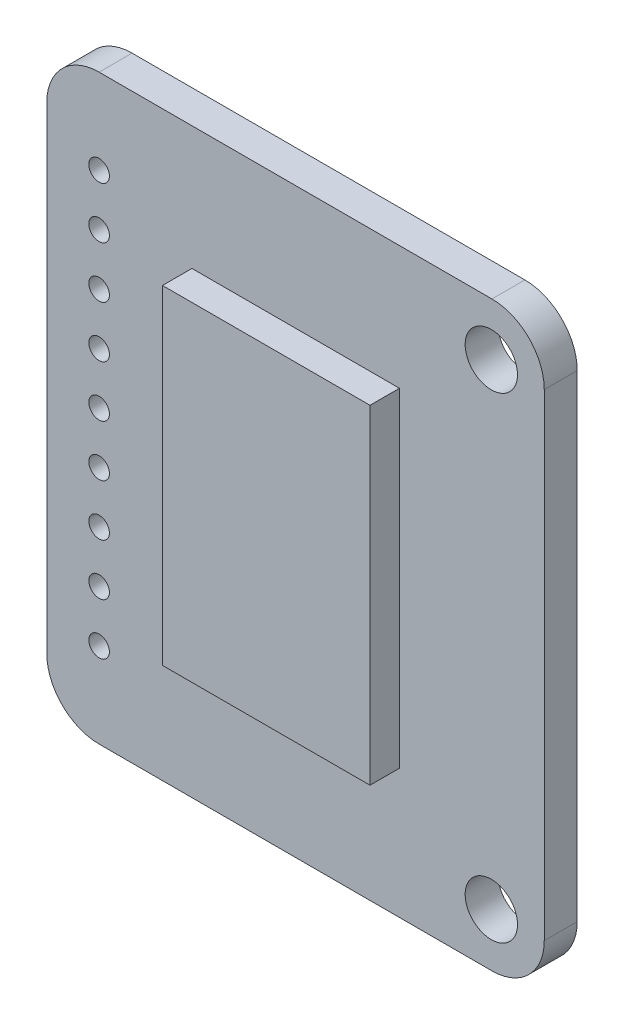
ISO-10303-21;
HEADER;
FILE_DESCRIPTION(('STEP AP214'),'2;1');
FILE_NAME('part.step','',(''),(''),'','','');
FILE_SCHEMA(('AUTOMOTIVE_DESIGN { 1 0 10303 214 1 1 1 1 }'));
ENDSEC;
DATA;
#1=APPLICATION_CONTEXT('core data for automotive mechanical design processes');
#2=APPLICATION_PROTOCOL_DEFINITION('international standard','automotive_design',2000,#1);
#3=PRODUCT_CONTEXT('',#1,'mechanical');
#4=PRODUCT('Part','Part','',(#3));
#5=PRODUCT_RELATED_PRODUCT_CATEGORY('part','',(#4));
#6=PRODUCT_DEFINITION_FORMATION('','',#4);
#7=PRODUCT_DEFINITION_CONTEXT('part definition',#1,'design');
#8=PRODUCT_DEFINITION('design','',#6,#7);
#9=PRODUCT_DEFINITION_SHAPE('','',#8);
#10=(LENGTH_UNIT() NAMED_UNIT(*) SI_UNIT(.MILLI.,.METRE.));
#11=(NAMED_UNIT(*) PLANE_ANGLE_UNIT() SI_UNIT($,.RADIAN.));
#12=(NAMED_UNIT(*) SI_UNIT($,.STERADIAN.) SOLID_ANGLE_UNIT());
#13=UNCERTAINTY_MEASURE_WITH_UNIT(LENGTH_MEASURE(1.E-05),#10,'distance_accuracy_value','');
#14=(GEOMETRIC_REPRESENTATION_CONTEXT(3) GLOBAL_UNCERTAINTY_ASSIGNED_CONTEXT((#13)) GLOBAL_UNIT_ASSIGNED_CONTEXT((#10,
#11,#12)) REPRESENTATION_CONTEXT('',''));
#15=CARTESIAN_POINT('',(0.,0.,0.));
#16=DIRECTION('',(0.,0.,1.));
#17=DIRECTION('',(1.,0.,0.));
#18=AXIS2_PLACEMENT_3D('',#15,#16,#17);
#19=CARTESIAN_POINT('',(0.,0.,1.6));
#20=DIRECTION('',(0.,0.,-1.));
#21=DIRECTION('',(-1.,0.,0.));
#22=AXIS2_PLACEMENT_3D('',#19,#20,#21);
#23=PLANE('',#22);
#24=DIRECTION('',(-1.,0.,0.));
#25=VECTOR('',#24,1.);
#26=CARTESIAN_POINT('',(-12.075,14.125,1.6));
#27=LINE('',#26,#25);
#28=CARTESIAN_POINT('',(9.535,14.125,1.6));
#29=VERTEX_POINT('',#28);
#30=CARTESIAN_POINT('',(-9.53499999999999,14.125,1.6));
#31=VERTEX_POINT('',#30);
#32=EDGE_CURVE('E220',#29,#31,#27,.T.);
#33=ORIENTED_EDGE('',*,*,#32,.T.);
#34=CARTESIAN_POINT('',(-9.53499999999999,11.585,1.6));
#35=DIRECTION('',(0.,0.,-1.));
#36=DIRECTION('',(-1.,0.,0.));
#37=AXIS2_PLACEMENT_3D('',#34,#35,#36);
#38=CIRCLE('',#37,2.54);
#39=CARTESIAN_POINT('',(-12.075,11.585,1.6));
#40=VERTEX_POINT('',#39);
#41=EDGE_CURVE('E264',#31,#40,#38,.F.);
#42=ORIENTED_EDGE('',*,*,#41,.T.);
#43=DIRECTION('',(0.,-1.,0.));
#44=VECTOR('',#43,1.);
#45=CARTESIAN_POINT('',(-12.075,-14.125,1.6));
#46=LINE('',#45,#44);
#47=CARTESIAN_POINT('',(-12.075,-11.585,1.6));
#48=VERTEX_POINT('',#47);
#49=EDGE_CURVE('E224',#40,#48,#46,.T.);
#50=ORIENTED_EDGE('',*,*,#49,.T.);
#51=CARTESIAN_POINT('',(-9.53499999999999,-11.585,1.6));
#52=DIRECTION('',(0.,0.,-1.));
#53=DIRECTION('',(-1.,0.,0.));
#54=AXIS2_PLACEMENT_3D('',#51,#52,#53);
#55=CIRCLE('',#54,2.54);
#56=CARTESIAN_POINT('',(-9.53499999999999,-14.125,1.6));
#57=VERTEX_POINT('',#56);
#58=EDGE_CURVE('E262',#48,#57,#55,.F.);
#59=ORIENTED_EDGE('',*,*,#58,.T.);
#60=DIRECTION('',(1.,0.,0.));
#61=VECTOR('',#60,1.);
#62=CARTESIAN_POINT('',(-12.075,-14.125,1.6));
#63=LINE('',#62,#61);
#64=CARTESIAN_POINT('',(9.535,-14.125,1.6));
#65=VERTEX_POINT('',#64);
#66=EDGE_CURVE('E227',#57,#65,#63,.T.);
#67=ORIENTED_EDGE('',*,*,#66,.T.);
#68=CARTESIAN_POINT('',(9.53500000000001,-11.585,1.6));
#69=DIRECTION('',(0.,0.,-1.));
#70=DIRECTION('',(-1.,0.,0.));
#71=AXIS2_PLACEMENT_3D('',#68,#69,#70);
#72=CIRCLE('',#71,2.54);
#73=CARTESIAN_POINT('',(12.075,-11.585,1.6));
#74=VERTEX_POINT('',#73);
#75=EDGE_CURVE('E260',#65,#74,#72,.F.);
#76=ORIENTED_EDGE('',*,*,#75,.T.);
#77=DIRECTION('',(0.,1.,0.));
#78=VECTOR('',#77,1.);
#79=CARTESIAN_POINT('',(12.075,-14.125,1.6));
#80=LINE('',#79,#78);
#81=CARTESIAN_POINT('',(12.075,11.585,1.6));
#82=VERTEX_POINT('',#81);
#83=EDGE_CURVE('E217',#74,#82,#80,.T.);
#84=ORIENTED_EDGE('',*,*,#83,.T.);
#85=CARTESIAN_POINT('',(9.53500000000001,11.585,1.6));
#86=DIRECTION('',(0.,0.,-1.));
#87=DIRECTION('',(-1.,0.,0.));
#88=AXIS2_PLACEMENT_3D('',#85,#86,#87);
#89=CIRCLE('',#88,2.54);
#90=EDGE_CURVE('E258',#82,#29,#89,.F.);
#91=ORIENTED_EDGE('',*,*,#90,.T.);
#92=EDGE_LOOP('',(#33,#42,#50,#59,#67,#76,#84,#91));
#93=FACE_BOUND('',#92,.T.);
#94=CARTESIAN_POINT('',(9.50500000000001,11.557,1.6));
#95=DIRECTION('',(0.,0.,1.));
#96=DIRECTION('',(1.,0.,0.));
#97=AXIS2_PLACEMENT_3D('',#94,#95,#96);
#98=CIRCLE('',#97,1.27);
#99=CARTESIAN_POINT('',(10.775,11.557,1.6));
#100=VERTEX_POINT('',#99);
#101=EDGE_CURVE('E208',#100,#100,#98,.T.);
#102=ORIENTED_EDGE('',*,*,#101,.F.);
#103=EDGE_LOOP('',(#102));
#104=FACE_BOUND('',#103,.T.);
#105=CARTESIAN_POINT('',(9.50500000000001,-11.557,1.6));
#106=DIRECTION('',(0.,0.,1.));
#107=DIRECTION('',(1.,0.,0.));
#108=AXIS2_PLACEMENT_3D('',#105,#106,#107);
#109=CIRCLE('',#108,1.27);
#110=CARTESIAN_POINT('',(10.775,-11.557,1.6));
#111=VERTEX_POINT('',#110);
#112=EDGE_CURVE('E202',#111,#111,#109,.T.);
#113=ORIENTED_EDGE('',*,*,#112,.F.);
#114=EDGE_LOOP('',(#113));
#115=FACE_BOUND('',#114,.T.);
#116=CARTESIAN_POINT('',(-9.53499999999999,0.,1.6));
#117=DIRECTION('',(0.,0.,1.));
#118=DIRECTION('',(1.,0.,0.));
#119=AXIS2_PLACEMENT_3D('',#116,#117,#118);
#120=CIRCLE('',#119,0.500000000000001);
#121=CARTESIAN_POINT('',(-9.03499999999999,0.,1.6));
#122=VERTEX_POINT('',#121);
#123=EDGE_CURVE('E198',#122,#122,#120,.T.);
#124=ORIENTED_EDGE('',*,*,#123,.F.);
#125=EDGE_LOOP('',(#124));
#126=FACE_BOUND('',#125,.T.);
#127=CARTESIAN_POINT('',(-9.53499999999999,-2.5,1.6));
#128=DIRECTION('',(0.,0.,1.));
#129=DIRECTION('',(1.,0.,0.));
#130=AXIS2_PLACEMENT_3D('',#127,#128,#129);
#131=CIRCLE('',#130,0.500000000000001);
#132=CARTESIAN_POINT('',(-9.03499999999999,-2.5,1.6));
#133=VERTEX_POINT('',#132);
#134=EDGE_CURVE('E195',#133,#133,#131,.T.);
#135=ORIENTED_EDGE('',*,*,#134,.F.);
#136=EDGE_LOOP('',(#135));
#137=FACE_BOUND('',#136,.T.);
#138=CARTESIAN_POINT('',(-9.53499999999999,10.,1.6));
#139=DIRECTION('',(0.,0.,1.));
#140=DIRECTION('',(1.,0.,0.));
#141=AXIS2_PLACEMENT_3D('',#138,#139,#140);
#142=CIRCLE('',#141,0.500000000000001);
#143=CARTESIAN_POINT('',(-9.03499999999999,10.,1.6));
#144=VERTEX_POINT('',#143);
#145=EDGE_CURVE('E148',#144,#144,#142,.T.);
#146=ORIENTED_EDGE('',*,*,#145,.F.);
#147=EDGE_LOOP('',(#146));
#148=FACE_BOUND('',#147,.T.);
#149=CARTESIAN_POINT('',(-9.53499999999999,7.5,1.6));
#150=DIRECTION('',(0.,0.,1.));
#151=DIRECTION('',(1.,0.,0.));
#152=AXIS2_PLACEMENT_3D('',#149,#150,#151);
#153=CIRCLE('',#152,0.500000000000001);
#154=CARTESIAN_POINT('',(-9.03499999999999,7.5,1.6));
#155=VERTEX_POINT('',#154);
#156=EDGE_CURVE('E183',#155,#155,#153,.T.);
#157=ORIENTED_EDGE('',*,*,#156,.F.);
#158=EDGE_LOOP('',(#157));
#159=FACE_BOUND('',#158,.T.);
#160=CARTESIAN_POINT('',(-9.53499999999999,5.,1.6));
#161=DIRECTION('',(0.,0.,1.));
#162=DIRECTION('',(1.,0.,0.));
#163=AXIS2_PLACEMENT_3D('',#160,#161,#162);
#164=CIRCLE('',#163,0.500000000000001);
#165=CARTESIAN_POINT('',(-9.03499999999999,5.,1.6));
#166=VERTEX_POINT('',#165);
#167=EDGE_CURVE('E177',#166,#166,#164,.T.);
#168=ORIENTED_EDGE('',*,*,#167,.F.);
#169=EDGE_LOOP('',(#168));
#170=FACE_BOUND('',#169,.T.);
#171=CARTESIAN_POINT('',(-9.53499999999999,2.5,1.6));
#172=DIRECTION('',(0.,0.,1.));
#173=DIRECTION('',(1.,0.,0.));
#174=AXIS2_PLACEMENT_3D('',#171,#172,#173);
#175=CIRCLE('',#174,0.500000000000001);
#176=CARTESIAN_POINT('',(-9.03499999999999,2.5,1.6));
#177=VERTEX_POINT('',#176);
#178=EDGE_CURVE('E171',#177,#177,#175,.T.);
#179=ORIENTED_EDGE('',*,*,#178,.F.);
#180=EDGE_LOOP('',(#179));
#181=FACE_BOUND('',#180,.T.);
#182=CARTESIAN_POINT('',(-9.53499999999999,-10.,1.6));
#183=DIRECTION('',(0.,0.,1.));
#184=DIRECTION('',(1.,0.,0.));
#185=AXIS2_PLACEMENT_3D('',#182,#183,#184);
#186=CIRCLE('',#185,0.500000000000001);
#187=CARTESIAN_POINT('',(-9.03499999999999,-10.,1.6));
#188=VERTEX_POINT('',#187);
#189=EDGE_CURVE('E165',#188,#188,#186,.T.);
#190=ORIENTED_EDGE('',*,*,#189,.F.);
#191=EDGE_LOOP('',(#190));
#192=FACE_BOUND('',#191,.T.);
#193=CARTESIAN_POINT('',(-9.53499999999999,-7.5,1.6));
#194=DIRECTION('',(0.,0.,1.));
#195=DIRECTION('',(1.,0.,0.));
#196=AXIS2_PLACEMENT_3D('',#193,#194,#195);
#197=CIRCLE('',#196,0.500000000000001);
#198=CARTESIAN_POINT('',(-9.03499999999999,-7.5,1.6));
#199=VERTEX_POINT('',#198);
#200=EDGE_CURVE('E158',#199,#199,#197,.T.);
#201=ORIENTED_EDGE('',*,*,#200,.F.);
#202=EDGE_LOOP('',(#201));
#203=FACE_BOUND('',#202,.T.);
#204=CARTESIAN_POINT('',(-9.53499999999999,-5.,1.6));
#205=DIRECTION('',(0.,0.,1.));
#206=DIRECTION('',(1.,0.,0.));
#207=AXIS2_PLACEMENT_3D('',#204,#205,#206);
#208=CIRCLE('',#207,0.500000000000001);
#209=CARTESIAN_POINT('',(-9.03499999999999,-5.,1.6));
#210=VERTEX_POINT('',#209);
#211=EDGE_CURVE('E157',#210,#210,#208,.T.);
#212=ORIENTED_EDGE('',*,*,#211,.F.);
#213=EDGE_LOOP('',(#212));
#214=FACE_BOUND('',#213,.T.);
#215=DIRECTION('',(0.,-1.,0.));
#216=VECTOR('',#215,1.);
#217=CARTESIAN_POINT('',(-5.02813725850615,8.12515711091066,1.6));
#218=LINE('',#217,#216);
#219=CARTESIAN_POINT('',(-5.02813725850615,8.12515711091066,1.6));
#220=VERTEX_POINT('',#219);
#221=CARTESIAN_POINT('',(-5.02813725850615,-7.84881272890914,1.6));
#222=VERTEX_POINT('',#221);
#223=EDGE_CURVE('E144',#220,#222,#218,.T.);
#224=ORIENTED_EDGE('',*,*,#223,.F.);
#225=DIRECTION('',(-1.,0.,0.));
#226=VECTOR('',#225,1.);
#227=CARTESIAN_POINT('',(-5.02813725850615,8.12515711091066,1.6));
#228=LINE('',#227,#226);
#229=CARTESIAN_POINT('',(5.04562579057932,8.12515711091066,1.6));
#230=VERTEX_POINT('',#229);
#231=EDGE_CURVE('E141',#230,#220,#228,.T.);
#232=ORIENTED_EDGE('',*,*,#231,.F.);
#233=DIRECTION('',(0.,1.,0.));
#234=VECTOR('',#233,1.);
#235=CARTESIAN_POINT('',(5.04562579057932,8.12515711091066,1.6));
#236=LINE('',#235,#234);
#237=CARTESIAN_POINT('',(5.04562579057932,-7.84881272890914,1.6));
#238=VERTEX_POINT('',#237);
#239=EDGE_CURVE('E55',#238,#230,#236,.T.);
#240=ORIENTED_EDGE('',*,*,#239,.F.);
#241=DIRECTION('',(1.,0.,0.));
#242=VECTOR('',#241,1.);
#243=CARTESIAN_POINT('',(-5.02813725850615,-7.84881272890914,1.6));
#244=LINE('',#243,#242);
#245=EDGE_CURVE('E50',#222,#238,#244,.T.);
#246=ORIENTED_EDGE('',*,*,#245,.F.);
#247=EDGE_LOOP('',(#224,#232,#240,#246));
#248=FACE_BOUND('',#247,.T.);
#249=ADVANCED_FACE('F35',(#93,#104,#115,#126,#137,#148,#159,#170,#181,#192,#203,#214,#248),#23,.F.);
#250=CARTESIAN_POINT('',(12.075,-14.125,1.6));
#251=DIRECTION('',(-1.,0.,0.));
#252=DIRECTION('',(0.,0.,1.));
#253=AXIS2_PLACEMENT_3D('',#250,#251,#252);
#254=PLANE('',#253);
#255=ORIENTED_EDGE('',*,*,#83,.F.);
#256=DIRECTION('',(0.,0.,-1.));
#257=VECTOR('',#256,1.);
#258=CARTESIAN_POINT('',(12.075,-11.585,1.6));
#259=LINE('',#258,#257);
#260=CARTESIAN_POINT('',(12.075,-11.585,0.));
#261=VERTEX_POINT('',#260);
#262=EDGE_CURVE('E11',#74,#261,#259,.T.);
#263=ORIENTED_EDGE('',*,*,#262,.T.);
#264=DIRECTION('',(0.,1.,0.));
#265=VECTOR('',#264,1.);
#266=CARTESIAN_POINT('',(12.075,-14.125,0.));
#267=LINE('',#266,#265);
#268=CARTESIAN_POINT('',(12.075,11.585,0.));
#269=VERTEX_POINT('',#268);
#270=EDGE_CURVE('E214',#261,#269,#267,.T.);
#271=ORIENTED_EDGE('',*,*,#270,.T.);
#272=DIRECTION('',(0.,0.,-1.));
#273=VECTOR('',#272,1.);
#274=CARTESIAN_POINT('',(12.075,11.585,1.6));
#275=LINE('',#274,#273);
#276=EDGE_CURVE('E43',#269,#82,#275,.F.);
#277=ORIENTED_EDGE('',*,*,#276,.T.);
#278=EDGE_LOOP('',(#255,#263,#271,#277));
#279=FACE_BOUND('',#278,.T.);
#280=ADVANCED_FACE('F273',(#279),#254,.F.);
#281=CARTESIAN_POINT('',(-12.075,14.125,1.6));
#282=DIRECTION('',(0.,-1.,0.));
#283=DIRECTION('',(0.,0.,-1.));
#284=AXIS2_PLACEMENT_3D('',#281,#282,#283);
#285=PLANE('',#284);
#286=DIRECTION('',(-1.,0.,0.));
#287=VECTOR('',#286,1.);
#288=CARTESIAN_POINT('',(-12.075,14.125,0.));
#289=LINE('',#288,#287);
#290=CARTESIAN_POINT('',(9.535,14.125,0.));
#291=VERTEX_POINT('',#290);
#292=CARTESIAN_POINT('',(-9.53499999999999,14.125,0.));
#293=VERTEX_POINT('',#292);
#294=EDGE_CURVE('E233',#291,#293,#289,.T.);
#295=ORIENTED_EDGE('',*,*,#294,.T.);
#296=DIRECTION('',(0.,0.,-1.));
#297=VECTOR('',#296,1.);
#298=CARTESIAN_POINT('',(-9.53499999999999,14.125,1.6));
#299=LINE('',#298,#297);
#300=EDGE_CURVE('E256',#293,#31,#299,.F.);
#301=ORIENTED_EDGE('',*,*,#300,.T.);
#302=ORIENTED_EDGE('',*,*,#32,.F.);
#303=DIRECTION('',(0.,0.,-1.));
#304=VECTOR('',#303,1.);
#305=CARTESIAN_POINT('',(9.53500000000001,14.125,1.6));
#306=LINE('',#305,#304);
#307=EDGE_CURVE('E253',#29,#291,#306,.T.);
#308=ORIENTED_EDGE('',*,*,#307,.T.);
#309=EDGE_LOOP('',(#295,#301,#302,#308));
#310=FACE_BOUND('',#309,.T.);
#311=ADVANCED_FACE('F285',(#310),#285,.F.);
#312=CARTESIAN_POINT('',(-12.075,-14.125,1.6));
#313=DIRECTION('',(1.,0.,0.));
#314=DIRECTION('',(0.,0.,-1.));
#315=AXIS2_PLACEMENT_3D('',#312,#313,#314);
#316=PLANE('',#315);
#317=ORIENTED_EDGE('',*,*,#49,.F.);
#318=DIRECTION('',(0.,0.,-1.));
#319=VECTOR('',#318,1.);
#320=CARTESIAN_POINT('',(-12.075,11.585,1.6));
#321=LINE('',#320,#319);
#322=CARTESIAN_POINT('',(-12.075,11.585,0.));
#323=VERTEX_POINT('',#322);
#324=EDGE_CURVE('E242',#40,#323,#321,.T.);
#325=ORIENTED_EDGE('',*,*,#324,.T.);
#326=DIRECTION('',(0.,-1.,0.));
#327=VECTOR('',#326,1.);
#328=CARTESIAN_POINT('',(-12.075,-14.125,0.));
#329=LINE('',#328,#327);
#330=CARTESIAN_POINT('',(-12.075,-11.585,0.));
#331=VERTEX_POINT('',#330);
#332=EDGE_CURVE('E236',#323,#331,#329,.T.);
#333=ORIENTED_EDGE('',*,*,#332,.T.);
#334=DIRECTION('',(0.,0.,-1.));
#335=VECTOR('',#334,1.);
#336=CARTESIAN_POINT('',(-12.075,-11.585,1.6));
#337=LINE('',#336,#335);
#338=EDGE_CURVE('E230',#331,#48,#337,.F.);
#339=ORIENTED_EDGE('',*,*,#338,.T.);
#340=EDGE_LOOP('',(#317,#325,#333,#339));
#341=FACE_BOUND('',#340,.T.);
#342=ADVANCED_FACE('F296',(#341),#316,.F.);
#343=CARTESIAN_POINT('',(-12.075,-14.125,1.6));
#344=DIRECTION('',(0.,1.,0.));
#345=DIRECTION('',(0.,0.,1.));
#346=AXIS2_PLACEMENT_3D('',#343,#344,#345);
#347=PLANE('',#346);
#348=ORIENTED_EDGE('',*,*,#66,.F.);
#349=DIRECTION('',(0.,0.,-1.));
#350=VECTOR('',#349,1.);
#351=CARTESIAN_POINT('',(-9.53499999999999,-14.125,1.6));
#352=LINE('',#351,#350);
#353=CARTESIAN_POINT('',(-9.53499999999999,-14.125,0.));
#354=VERTEX_POINT('',#353);
#355=EDGE_CURVE('E268',#57,#354,#352,.T.);
#356=ORIENTED_EDGE('',*,*,#355,.T.);
#357=DIRECTION('',(1.,0.,0.));
#358=VECTOR('',#357,1.);
#359=CARTESIAN_POINT('',(-12.075,-14.125,0.));
#360=LINE('',#359,#358);
#361=CARTESIAN_POINT('',(9.535,-14.125,0.));
#362=VERTEX_POINT('',#361);
#363=EDGE_CURVE('E221',#354,#362,#360,.T.);
#364=ORIENTED_EDGE('',*,*,#363,.T.);
#365=DIRECTION('',(0.,0.,-1.));
#366=VECTOR('',#365,1.);
#367=CARTESIAN_POINT('',(9.53500000000001,-14.125,1.6));
#368=LINE('',#367,#366);
#369=EDGE_CURVE('E266',#362,#65,#368,.F.);
#370=ORIENTED_EDGE('',*,*,#369,.T.);
#371=EDGE_LOOP('',(#348,#356,#364,#370));
#372=FACE_BOUND('',#371,.T.);
#373=ADVANCED_FACE('F305',(#372),#347,.F.);
#374=CARTESIAN_POINT('',(0.,0.,0.));
#375=DIRECTION('',(0.,0.,-1.));
#376=DIRECTION('',(-1.,0.,0.));
#377=AXIS2_PLACEMENT_3D('',#374,#375,#376);
#378=PLANE('',#377);
#379=CARTESIAN_POINT('',(-9.53499999999999,-5.,0.));
#380=DIRECTION('',(0.,0.,1.));
#381=DIRECTION('',(1.,0.,0.));
#382=AXIS2_PLACEMENT_3D('',#379,#380,#381);
#383=CIRCLE('',#382,0.500000000000001);
#384=CARTESIAN_POINT('',(-9.03499999999999,-5.,0.));
#385=VERTEX_POINT('',#384);
#386=EDGE_CURVE('E154',#385,#385,#383,.T.);
#387=ORIENTED_EDGE('',*,*,#386,.T.);
#388=EDGE_LOOP('',(#387));
#389=FACE_BOUND('',#388,.T.);
#390=CARTESIAN_POINT('',(-9.53499999999999,-7.5,0.));
#391=DIRECTION('',(0.,0.,1.));
#392=DIRECTION('',(1.,0.,0.));
#393=AXIS2_PLACEMENT_3D('',#390,#391,#392);
#394=CIRCLE('',#393,0.500000000000001);
#395=CARTESIAN_POINT('',(-9.03499999999999,-7.5,0.));
#396=VERTEX_POINT('',#395);
#397=EDGE_CURVE('E162',#396,#396,#394,.T.);
#398=ORIENTED_EDGE('',*,*,#397,.T.);
#399=EDGE_LOOP('',(#398));
#400=FACE_BOUND('',#399,.T.);
#401=CARTESIAN_POINT('',(-9.53499999999999,-10.,0.));
#402=DIRECTION('',(0.,0.,1.));
#403=DIRECTION('',(1.,0.,0.));
#404=AXIS2_PLACEMENT_3D('',#401,#402,#403);
#405=CIRCLE('',#404,0.500000000000001);
#406=CARTESIAN_POINT('',(-9.03499999999999,-10.,0.));
#407=VERTEX_POINT('',#406);
#408=EDGE_CURVE('E168',#407,#407,#405,.T.);
#409=ORIENTED_EDGE('',*,*,#408,.T.);
#410=EDGE_LOOP('',(#409));
#411=FACE_BOUND('',#410,.T.);
#412=CARTESIAN_POINT('',(-9.53499999999999,2.5,0.));
#413=DIRECTION('',(0.,0.,1.));
#414=DIRECTION('',(1.,0.,0.));
#415=AXIS2_PLACEMENT_3D('',#412,#413,#414);
#416=CIRCLE('',#415,0.500000000000001);
#417=CARTESIAN_POINT('',(-9.03499999999999,2.5,0.));
#418=VERTEX_POINT('',#417);
#419=EDGE_CURVE('E174',#418,#418,#416,.T.);
#420=ORIENTED_EDGE('',*,*,#419,.T.);
#421=EDGE_LOOP('',(#420));
#422=FACE_BOUND('',#421,.T.);
#423=CARTESIAN_POINT('',(-9.53499999999999,5.,0.));
#424=DIRECTION('',(0.,0.,1.));
#425=DIRECTION('',(1.,0.,0.));
#426=AXIS2_PLACEMENT_3D('',#423,#424,#425);
#427=CIRCLE('',#426,0.500000000000001);
#428=CARTESIAN_POINT('',(-9.03499999999999,5.,0.));
#429=VERTEX_POINT('',#428);
#430=EDGE_CURVE('E180',#429,#429,#427,.T.);
#431=ORIENTED_EDGE('',*,*,#430,.T.);
#432=EDGE_LOOP('',(#431));
#433=FACE_BOUND('',#432,.T.);
#434=CARTESIAN_POINT('',(-9.53499999999999,7.5,0.));
#435=DIRECTION('',(0.,0.,1.));
#436=DIRECTION('',(1.,0.,0.));
#437=AXIS2_PLACEMENT_3D('',#434,#435,#436);
#438=CIRCLE('',#437,0.500000000000001);
#439=CARTESIAN_POINT('',(-9.03499999999999,7.5,0.));
#440=VERTEX_POINT('',#439);
#441=EDGE_CURVE('E186',#440,#440,#438,.T.);
#442=ORIENTED_EDGE('',*,*,#441,.T.);
#443=EDGE_LOOP('',(#442));
#444=FACE_BOUND('',#443,.T.);
#445=CARTESIAN_POINT('',(-9.53499999999999,10.,0.));
#446=DIRECTION('',(0.,0.,1.));
#447=DIRECTION('',(1.,0.,0.));
#448=AXIS2_PLACEMENT_3D('',#445,#446,#447);
#449=CIRCLE('',#448,0.500000000000001);
#450=CARTESIAN_POINT('',(-9.03499999999999,10.,0.));
#451=VERTEX_POINT('',#450);
#452=EDGE_CURVE('E145',#451,#451,#449,.T.);
#453=ORIENTED_EDGE('',*,*,#452,.T.);
#454=EDGE_LOOP('',(#453));
#455=FACE_BOUND('',#454,.T.);
#456=CARTESIAN_POINT('',(-9.53499999999999,-2.5,0.));
#457=DIRECTION('',(0.,0.,1.));
#458=DIRECTION('',(1.,0.,0.));
#459=AXIS2_PLACEMENT_3D('',#456,#457,#458);
#460=CIRCLE('',#459,0.500000000000001);
#461=CARTESIAN_POINT('',(-9.03499999999999,-2.5,0.));
#462=VERTEX_POINT('',#461);
#463=EDGE_CURVE('E161',#462,#462,#460,.T.);
#464=ORIENTED_EDGE('',*,*,#463,.T.);
#465=EDGE_LOOP('',(#464));
#466=FACE_BOUND('',#465,.T.);
#467=CARTESIAN_POINT('',(-9.53499999999999,0.,0.));
#468=DIRECTION('',(0.,0.,1.));
#469=DIRECTION('',(1.,0.,0.));
#470=AXIS2_PLACEMENT_3D('',#467,#468,#469);
#471=CIRCLE('',#470,0.500000000000001);
#472=CARTESIAN_POINT('',(-9.03499999999999,0.,0.));
#473=VERTEX_POINT('',#472);
#474=EDGE_CURVE('E199',#473,#473,#471,.T.);
#475=ORIENTED_EDGE('',*,*,#474,.T.);
#476=EDGE_LOOP('',(#475));
#477=FACE_BOUND('',#476,.T.);
#478=CARTESIAN_POINT('',(9.50500000000001,-11.557,0.));
#479=DIRECTION('',(0.,0.,1.));
#480=DIRECTION('',(1.,0.,0.));
#481=AXIS2_PLACEMENT_3D('',#478,#479,#480);
#482=CIRCLE('',#481,1.27);
#483=CARTESIAN_POINT('',(10.775,-11.557,0.));
#484=VERTEX_POINT('',#483);
#485=EDGE_CURVE('E205',#484,#484,#482,.T.);
#486=ORIENTED_EDGE('',*,*,#485,.T.);
#487=EDGE_LOOP('',(#486));
#488=FACE_BOUND('',#487,.T.);
#489=CARTESIAN_POINT('',(9.50500000000001,11.557,0.));
#490=DIRECTION('',(0.,0.,1.));
#491=DIRECTION('',(1.,0.,0.));
#492=AXIS2_PLACEMENT_3D('',#489,#490,#491);
#493=CIRCLE('',#492,1.27);
#494=CARTESIAN_POINT('',(10.775,11.557,0.));
#495=VERTEX_POINT('',#494);
#496=EDGE_CURVE('E211',#495,#495,#493,.T.);
#497=ORIENTED_EDGE('',*,*,#496,.T.);
#498=EDGE_LOOP('',(#497));
#499=FACE_BOUND('',#498,.T.);
#500=ORIENTED_EDGE('',*,*,#332,.F.);
#501=CARTESIAN_POINT('',(-9.53499999999999,11.585,0.));
#502=DIRECTION('',(0.,0.,-1.));
#503=DIRECTION('',(-1.,0.,0.));
#504=AXIS2_PLACEMENT_3D('',#501,#502,#503);
#505=CIRCLE('',#504,2.54);
#506=EDGE_CURVE('E251',#323,#293,#505,.T.);
#507=ORIENTED_EDGE('',*,*,#506,.T.);
#508=ORIENTED_EDGE('',*,*,#294,.F.);
#509=CARTESIAN_POINT('',(9.53500000000001,11.585,0.));
#510=DIRECTION('',(0.,0.,-1.));
#511=DIRECTION('',(-1.,0.,0.));
#512=AXIS2_PLACEMENT_3D('',#509,#510,#511);
#513=CIRCLE('',#512,2.54);
#514=EDGE_CURVE('E245',#291,#269,#513,.T.);
#515=ORIENTED_EDGE('',*,*,#514,.T.);
#516=ORIENTED_EDGE('',*,*,#270,.F.);
#517=CARTESIAN_POINT('',(9.53500000000001,-11.585,0.));
#518=DIRECTION('',(0.,0.,-1.));
#519=DIRECTION('',(-1.,0.,0.));
#520=AXIS2_PLACEMENT_3D('',#517,#518,#519);
#521=CIRCLE('',#520,2.54);
#522=EDGE_CURVE('E247',#261,#362,#521,.T.);
#523=ORIENTED_EDGE('',*,*,#522,.T.);
#524=ORIENTED_EDGE('',*,*,#363,.F.);
#525=CARTESIAN_POINT('',(-9.53499999999999,-11.585,0.));
#526=DIRECTION('',(0.,0.,-1.));
#527=DIRECTION('',(-1.,0.,0.));
#528=AXIS2_PLACEMENT_3D('',#525,#526,#527);
#529=CIRCLE('',#528,2.54);
#530=EDGE_CURVE('E249',#354,#331,#529,.T.);
#531=ORIENTED_EDGE('',*,*,#530,.T.);
#532=EDGE_LOOP('',(#500,#507,#508,#515,#516,#523,#524,#531));
#533=FACE_BOUND('',#532,.T.);
#534=ADVANCED_FACE('F289',(#389,#400,#411,#422,#433,#444,#455,#466,#477,#488,#499,#533),#378,.T.);
#535=CARTESIAN_POINT('',(9.50500000000001,11.557,0.));
#536=DIRECTION('',(0.,0.,1.));
#537=DIRECTION('',(1.,0.,0.));
#538=AXIS2_PLACEMENT_3D('',#535,#536,#537);
#539=CYLINDRICAL_SURFACE('',#538,1.27);
#540=ORIENTED_EDGE('',*,*,#496,.F.);
#541=EDGE_LOOP('',(#540));
#542=FACE_BOUND('',#541,.T.);
#543=ORIENTED_EDGE('',*,*,#101,.T.);
#544=EDGE_LOOP('',(#543));
#545=FACE_BOUND('',#544,.T.);
#546=ADVANCED_FACE('F324',(#542,#545),#539,.F.);
#547=CARTESIAN_POINT('',(9.50500000000001,-11.557,0.));
#548=DIRECTION('',(0.,0.,1.));
#549=DIRECTION('',(1.,0.,0.));
#550=AXIS2_PLACEMENT_3D('',#547,#548,#549);
#551=CYLINDRICAL_SURFACE('',#550,1.27);
#552=ORIENTED_EDGE('',*,*,#485,.F.);
#553=EDGE_LOOP('',(#552));
#554=FACE_BOUND('',#553,.T.);
#555=ORIENTED_EDGE('',*,*,#112,.T.);
#556=EDGE_LOOP('',(#555));
#557=FACE_BOUND('',#556,.T.);
#558=ADVANCED_FACE('F336',(#554,#557),#551,.F.);
#559=CARTESIAN_POINT('',(-9.53499999999999,11.585,1.6));
#560=DIRECTION('',(0.,0.,-1.));
#561=DIRECTION('',(-1.,0.,0.));
#562=AXIS2_PLACEMENT_3D('',#559,#560,#561);
#563=CYLINDRICAL_SURFACE('',#562,2.54);
#564=ORIENTED_EDGE('',*,*,#41,.F.);
#565=ORIENTED_EDGE('',*,*,#300,.F.);
#566=ORIENTED_EDGE('',*,*,#506,.F.);
#567=ORIENTED_EDGE('',*,*,#324,.F.);
#568=EDGE_LOOP('',(#564,#565,#566,#567));
#569=FACE_BOUND('',#568,.T.);
#570=ADVANCED_FACE('F293',(#569),#563,.T.);
#571=CARTESIAN_POINT('',(-9.53499999999999,-11.585,1.6));
#572=DIRECTION('',(0.,0.,-1.));
#573=DIRECTION('',(-1.,0.,0.));
#574=AXIS2_PLACEMENT_3D('',#571,#572,#573);
#575=CYLINDRICAL_SURFACE('',#574,2.54);
#576=ORIENTED_EDGE('',*,*,#58,.F.);
#577=ORIENTED_EDGE('',*,*,#338,.F.);
#578=ORIENTED_EDGE('',*,*,#530,.F.);
#579=ORIENTED_EDGE('',*,*,#355,.F.);
#580=EDGE_LOOP('',(#576,#577,#578,#579));
#581=FACE_BOUND('',#580,.T.);
#582=ADVANCED_FACE('F302',(#581),#575,.T.);
#583=CARTESIAN_POINT('',(9.53500000000001,-11.585,1.6));
#584=DIRECTION('',(0.,0.,-1.));
#585=DIRECTION('',(-1.,0.,0.));
#586=AXIS2_PLACEMENT_3D('',#583,#584,#585);
#587=CYLINDRICAL_SURFACE('',#586,2.54);
#588=ORIENTED_EDGE('',*,*,#75,.F.);
#589=ORIENTED_EDGE('',*,*,#369,.F.);
#590=ORIENTED_EDGE('',*,*,#522,.F.);
#591=ORIENTED_EDGE('',*,*,#262,.F.);
#592=EDGE_LOOP('',(#588,#589,#590,#591));
#593=FACE_BOUND('',#592,.T.);
#594=ADVANCED_FACE('F308',(#593),#587,.T.);
#595=CARTESIAN_POINT('',(9.53500000000001,11.585,1.6));
#596=DIRECTION('',(0.,0.,-1.));
#597=DIRECTION('',(-1.,0.,0.));
#598=AXIS2_PLACEMENT_3D('',#595,#596,#597);
#599=CYLINDRICAL_SURFACE('',#598,2.54);
#600=ORIENTED_EDGE('',*,*,#90,.F.);
#601=ORIENTED_EDGE('',*,*,#276,.F.);
#602=ORIENTED_EDGE('',*,*,#514,.F.);
#603=ORIENTED_EDGE('',*,*,#307,.F.);
#604=EDGE_LOOP('',(#600,#601,#602,#603));
#605=FACE_BOUND('',#604,.T.);
#606=ADVANCED_FACE('F37',(#605),#599,.T.);
#607=CARTESIAN_POINT('',(-9.53499999999999,0.,0.));
#608=DIRECTION('',(0.,0.,1.));
#609=DIRECTION('',(1.,0.,0.));
#610=AXIS2_PLACEMENT_3D('',#607,#608,#609);
#611=CYLINDRICAL_SURFACE('',#610,0.500000000000001);
#612=ORIENTED_EDGE('',*,*,#474,.F.);
#613=EDGE_LOOP('',(#612));
#614=FACE_BOUND('',#613,.T.);
#615=ORIENTED_EDGE('',*,*,#123,.T.);
#616=EDGE_LOOP('',(#615));
#617=FACE_BOUND('',#616,.T.);
#618=ADVANCED_FACE('F314',(#614,#617),#611,.F.);
#619=CARTESIAN_POINT('',(-9.53499999999999,-2.5,0.));
#620=DIRECTION('',(0.,0.,1.));
#621=DIRECTION('',(1.,0.,0.));
#622=AXIS2_PLACEMENT_3D('',#619,#620,#621);
#623=CYLINDRICAL_SURFACE('',#622,0.500000000000001);
#624=ORIENTED_EDGE('',*,*,#463,.F.);
#625=EDGE_LOOP('',(#624));
#626=FACE_BOUND('',#625,.T.);
#627=ORIENTED_EDGE('',*,*,#134,.T.);
#628=EDGE_LOOP('',(#627));
#629=FACE_BOUND('',#628,.T.);
#630=ADVANCED_FACE('F350',(#626,#629),#623,.F.);
#631=CARTESIAN_POINT('',(-9.53499999999999,10.,0.));
#632=DIRECTION('',(0.,0.,1.));
#633=DIRECTION('',(1.,0.,0.));
#634=AXIS2_PLACEMENT_3D('',#631,#632,#633);
#635=CYLINDRICAL_SURFACE('',#634,0.500000000000001);
#636=ORIENTED_EDGE('',*,*,#452,.F.);
#637=EDGE_LOOP('',(#636));
#638=FACE_BOUND('',#637,.T.);
#639=ORIENTED_EDGE('',*,*,#145,.T.);
#640=EDGE_LOOP('',(#639));
#641=FACE_BOUND('',#640,.T.);
#642=ADVANCED_FACE('F354',(#638,#641),#635,.F.);
#643=CARTESIAN_POINT('',(-9.53499999999999,7.5,0.));
#644=DIRECTION('',(0.,0.,1.));
#645=DIRECTION('',(1.,0.,0.));
#646=AXIS2_PLACEMENT_3D('',#643,#644,#645);
#647=CYLINDRICAL_SURFACE('',#646,0.500000000000001);
#648=ORIENTED_EDGE('',*,*,#441,.F.);
#649=EDGE_LOOP('',(#648));
#650=FACE_BOUND('',#649,.T.);
#651=ORIENTED_EDGE('',*,*,#156,.T.);
#652=EDGE_LOOP('',(#651));
#653=FACE_BOUND('',#652,.T.);
#654=ADVANCED_FACE('F358',(#650,#653),#647,.F.);
#655=CARTESIAN_POINT('',(-9.53499999999999,5.,0.));
#656=DIRECTION('',(0.,0.,1.));
#657=DIRECTION('',(1.,0.,0.));
#658=AXIS2_PLACEMENT_3D('',#655,#656,#657);
#659=CYLINDRICAL_SURFACE('',#658,0.500000000000001);
#660=ORIENTED_EDGE('',*,*,#430,.F.);
#661=EDGE_LOOP('',(#660));
#662=FACE_BOUND('',#661,.T.);
#663=ORIENTED_EDGE('',*,*,#167,.T.);
#664=EDGE_LOOP('',(#663));
#665=FACE_BOUND('',#664,.T.);
#666=ADVANCED_FACE('F362',(#662,#665),#659,.F.);
#667=CARTESIAN_POINT('',(-9.53499999999999,2.5,0.));
#668=DIRECTION('',(0.,0.,1.));
#669=DIRECTION('',(1.,0.,0.));
#670=AXIS2_PLACEMENT_3D('',#667,#668,#669);
#671=CYLINDRICAL_SURFACE('',#670,0.500000000000001);
#672=ORIENTED_EDGE('',*,*,#419,.F.);
#673=EDGE_LOOP('',(#672));
#674=FACE_BOUND('',#673,.T.);
#675=ORIENTED_EDGE('',*,*,#178,.T.);
#676=EDGE_LOOP('',(#675));
#677=FACE_BOUND('',#676,.T.);
#678=ADVANCED_FACE('F366',(#674,#677),#671,.F.);
#679=CARTESIAN_POINT('',(-9.53499999999999,-10.,0.));
#680=DIRECTION('',(0.,0.,1.));
#681=DIRECTION('',(1.,0.,0.));
#682=AXIS2_PLACEMENT_3D('',#679,#680,#681);
#683=CYLINDRICAL_SURFACE('',#682,0.500000000000001);
#684=ORIENTED_EDGE('',*,*,#408,.F.);
#685=EDGE_LOOP('',(#684));
#686=FACE_BOUND('',#685,.T.);
#687=ORIENTED_EDGE('',*,*,#189,.T.);
#688=EDGE_LOOP('',(#687));
#689=FACE_BOUND('',#688,.T.);
#690=ADVANCED_FACE('F370',(#686,#689),#683,.F.);
#691=CARTESIAN_POINT('',(-9.53499999999999,-7.5,0.));
#692=DIRECTION('',(0.,0.,1.));
#693=DIRECTION('',(1.,0.,0.));
#694=AXIS2_PLACEMENT_3D('',#691,#692,#693);
#695=CYLINDRICAL_SURFACE('',#694,0.500000000000001);
#696=ORIENTED_EDGE('',*,*,#397,.F.);
#697=EDGE_LOOP('',(#696));
#698=FACE_BOUND('',#697,.T.);
#699=ORIENTED_EDGE('',*,*,#200,.T.);
#700=EDGE_LOOP('',(#699));
#701=FACE_BOUND('',#700,.T.);
#702=ADVANCED_FACE('F374',(#698,#701),#695,.F.);
#703=CARTESIAN_POINT('',(-9.53499999999999,-5.,0.));
#704=DIRECTION('',(0.,0.,1.));
#705=DIRECTION('',(1.,0.,0.));
#706=AXIS2_PLACEMENT_3D('',#703,#704,#705);
#707=CYLINDRICAL_SURFACE('',#706,0.500000000000001);
#708=ORIENTED_EDGE('',*,*,#386,.F.);
#709=EDGE_LOOP('',(#708));
#710=FACE_BOUND('',#709,.T.);
#711=ORIENTED_EDGE('',*,*,#211,.T.);
#712=EDGE_LOOP('',(#711));
#713=FACE_BOUND('',#712,.T.);
#714=ADVANCED_FACE('F378',(#710,#713),#707,.F.);
#715=CARTESIAN_POINT('',(-5.02813725850615,8.12515711091066,3.03));
#716=DIRECTION('',(1.,0.,0.));
#717=DIRECTION('',(0.,0.,-1.));
#718=AXIS2_PLACEMENT_3D('',#715,#716,#717);
#719=PLANE('',#718);
#720=ORIENTED_EDGE('',*,*,#223,.T.);
#721=DIRECTION('',(0.,0.,-1.));
#722=VECTOR('',#721,1.);
#723=CARTESIAN_POINT('',(-5.02813725850615,-7.84881272890914,3.03));
#724=LINE('',#723,#722);
#725=CARTESIAN_POINT('',(-5.02813725850615,-7.84881272890914,3.03));
#726=VERTEX_POINT('',#725);
#727=EDGE_CURVE('E125',#726,#222,#724,.T.);
#728=ORIENTED_EDGE('',*,*,#727,.F.);
#729=DIRECTION('',(0.,-1.,0.));
#730=VECTOR('',#729,1.);
#731=CARTESIAN_POINT('',(-5.02813725850615,8.12515711091066,3.03));
#732=LINE('',#731,#730);
#733=CARTESIAN_POINT('',(-5.02813725850615,8.12515711091066,3.03));
#734=VERTEX_POINT('',#733);
#735=EDGE_CURVE('E132',#734,#726,#732,.T.);
#736=ORIENTED_EDGE('',*,*,#735,.F.);
#737=DIRECTION('',(0.,0.,-1.));
#738=VECTOR('',#737,1.);
#739=CARTESIAN_POINT('',(-5.02813725850615,8.12515711091066,3.03));
#740=LINE('',#739,#738);
#741=EDGE_CURVE('E568',#734,#220,#740,.T.);
#742=ORIENTED_EDGE('',*,*,#741,.T.);
#743=EDGE_LOOP('',(#720,#728,#736,#742));
#744=FACE_BOUND('',#743,.T.);
#745=ADVANCED_FACE('F143',(#744),#719,.F.);
#746=CARTESIAN_POINT('',(-5.02813725850615,-7.84881272890914,3.03));
#747=DIRECTION('',(0.,1.,0.));
#748=DIRECTION('',(0.,0.,1.));
#749=AXIS2_PLACEMENT_3D('',#746,#747,#748);
#750=PLANE('',#749);
#751=ORIENTED_EDGE('',*,*,#245,.T.);
#752=DIRECTION('',(0.,0.,-1.));
#753=VECTOR('',#752,1.);
#754=CARTESIAN_POINT('',(5.04562579057932,-7.84881272890914,3.03));
#755=LINE('',#754,#753);
#756=CARTESIAN_POINT('',(5.04562579057932,-7.84881272890914,3.03));
#757=VERTEX_POINT('',#756);
#758=EDGE_CURVE('E128',#757,#238,#755,.T.);
#759=ORIENTED_EDGE('',*,*,#758,.F.);
#760=DIRECTION('',(1.,0.,0.));
#761=VECTOR('',#760,1.);
#762=CARTESIAN_POINT('',(-5.02813725850615,-7.84881272890914,3.03));
#763=LINE('',#762,#761);
#764=EDGE_CURVE('E121',#726,#757,#763,.T.);
#765=ORIENTED_EDGE('',*,*,#764,.F.);
#766=ORIENTED_EDGE('',*,*,#727,.T.);
#767=EDGE_LOOP('',(#751,#759,#765,#766));
#768=FACE_BOUND('',#767,.T.);
#769=ADVANCED_FACE('F123',(#768),#750,.F.);
#770=CARTESIAN_POINT('',(5.04562579057932,8.12515711091066,3.03));
#771=DIRECTION('',(-1.,0.,0.));
#772=DIRECTION('',(0.,0.,1.));
#773=AXIS2_PLACEMENT_3D('',#770,#771,#772);
#774=PLANE('',#773);
#775=ORIENTED_EDGE('',*,*,#239,.T.);
#776=DIRECTION('',(0.,0.,-1.));
#777=VECTOR('',#776,1.);
#778=CARTESIAN_POINT('',(5.04562579057932,8.12515711091066,3.03));
#779=LINE('',#778,#777);
#780=CARTESIAN_POINT('',(5.04562579057932,8.12515711091066,3.03));
#781=VERTEX_POINT('',#780);
#782=EDGE_CURVE('E150',#781,#230,#779,.T.);
#783=ORIENTED_EDGE('',*,*,#782,.F.);
#784=DIRECTION('',(0.,1.,0.));
#785=VECTOR('',#784,1.);
#786=CARTESIAN_POINT('',(5.04562579057932,8.12515711091066,3.03));
#787=LINE('',#786,#785);
#788=EDGE_CURVE('E131',#757,#781,#787,.T.);
#789=ORIENTED_EDGE('',*,*,#788,.F.);
#790=ORIENTED_EDGE('',*,*,#758,.T.);
#791=EDGE_LOOP('',(#775,#783,#789,#790));
#792=FACE_BOUND('',#791,.T.);
#793=ADVANCED_FACE('F387',(#792),#774,.F.);
#794=CARTESIAN_POINT('',(-5.02813725850615,8.12515711091066,3.03));
#795=DIRECTION('',(0.,-1.,0.));
#796=DIRECTION('',(0.,0.,-1.));
#797=AXIS2_PLACEMENT_3D('',#794,#795,#796);
#798=PLANE('',#797);
#799=ORIENTED_EDGE('',*,*,#231,.T.);
#800=ORIENTED_EDGE('',*,*,#741,.F.);
#801=DIRECTION('',(-1.,0.,0.));
#802=VECTOR('',#801,1.);
#803=CARTESIAN_POINT('',(-5.02813725850615,8.12515711091066,3.03));
#804=LINE('',#803,#802);
#805=EDGE_CURVE('E137',#781,#734,#804,.T.);
#806=ORIENTED_EDGE('',*,*,#805,.F.);
#807=ORIENTED_EDGE('',*,*,#782,.T.);
#808=EDGE_LOOP('',(#799,#800,#806,#807));
#809=FACE_BOUND('',#808,.T.);
#810=ADVANCED_FACE('F390',(#809),#798,.F.);
#811=CARTESIAN_POINT('',(0.,0.,3.03));
#812=DIRECTION('',(0.,0.,1.));
#813=DIRECTION('',(1.,0.,0.));
#814=AXIS2_PLACEMENT_3D('',#811,#812,#813);
#815=PLANE('',#814);
#816=ORIENTED_EDGE('',*,*,#735,.T.);
#817=ORIENTED_EDGE('',*,*,#764,.T.);
#818=ORIENTED_EDGE('',*,*,#788,.T.);
#819=ORIENTED_EDGE('',*,*,#805,.T.);
#820=EDGE_LOOP('',(#816,#817,#818,#819));
#821=FACE_BOUND('',#820,.T.);
#822=ADVANCED_FACE('F135',(#821),#815,.T.);
#823=CLOSED_SHELL('',(#249,#280,#311,#342,#373,#534,#546,#558,#570,#582,#594,#606,#618,#630,
#642,#654,#666,#678,#690,#702,#714,#745,#769,#793,#810,#822));
#824=MANIFOLD_SOLID_BREP('B2',#823);
#825=ADVANCED_BREP_SHAPE_REPRESENTATION('',(#18,#824),#14);
#826=SHAPE_DEFINITION_REPRESENTATION(#9,#825);
ENDSEC;
END-ISO-10303-21;
